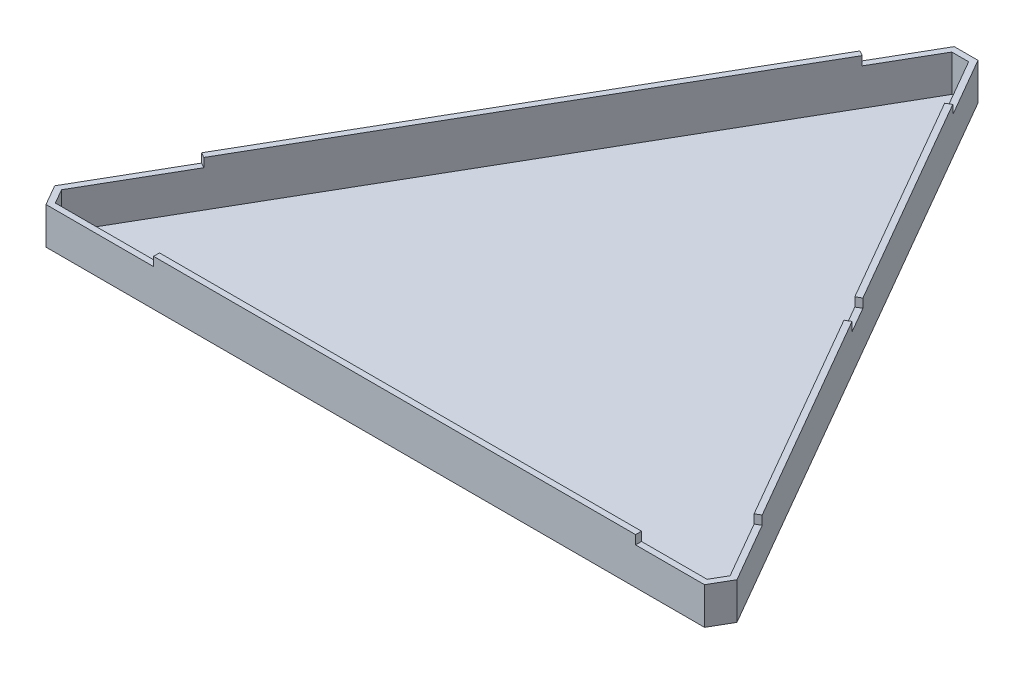
ISO-10303-21;
HEADER;
FILE_DESCRIPTION(('STEP AP214'),'2;1');
FILE_NAME('part.step','',(''),(''),'','','');
FILE_SCHEMA(('AUTOMOTIVE_DESIGN { 1 0 10303 214 1 1 1 1 }'));
ENDSEC;
DATA;
#1=APPLICATION_CONTEXT('core data for automotive mechanical design processes');
#2=APPLICATION_PROTOCOL_DEFINITION('international standard','automotive_design',2000,#1);
#3=PRODUCT_CONTEXT('',#1,'mechanical');
#4=PRODUCT('Part','Part','',(#3));
#5=PRODUCT_RELATED_PRODUCT_CATEGORY('part','',(#4));
#6=PRODUCT_DEFINITION_FORMATION('','',#4);
#7=PRODUCT_DEFINITION_CONTEXT('part definition',#1,'design');
#8=PRODUCT_DEFINITION('design','',#6,#7);
#9=PRODUCT_DEFINITION_SHAPE('','',#8);
#10=(LENGTH_UNIT() NAMED_UNIT(*) SI_UNIT(.MILLI.,.METRE.));
#11=(NAMED_UNIT(*) PLANE_ANGLE_UNIT() SI_UNIT($,.RADIAN.));
#12=(NAMED_UNIT(*) SI_UNIT($,.STERADIAN.) SOLID_ANGLE_UNIT());
#13=UNCERTAINTY_MEASURE_WITH_UNIT(LENGTH_MEASURE(1.E-05),#10,'distance_accuracy_value','');
#14=(GEOMETRIC_REPRESENTATION_CONTEXT(3) GLOBAL_UNCERTAINTY_ASSIGNED_CONTEXT((#13)) GLOBAL_UNIT_ASSIGNED_CONTEXT((#10,
#11,#12)) REPRESENTATION_CONTEXT('',''));
#15=CARTESIAN_POINT('',(0.,0.,0.));
#16=DIRECTION('',(0.,0.,1.));
#17=DIRECTION('',(1.,0.,0.));
#18=AXIS2_PLACEMENT_3D('',#15,#16,#17);
#19=CARTESIAN_POINT('',(0.,0.08,0.));
#20=DIRECTION('',(0.,1.,0.));
#21=DIRECTION('',(0.,0.,1.));
#22=AXIS2_PLACEMENT_3D('',#19,#20,#21);
#23=PLANE('',#22);
#24=DIRECTION('',(0.500000000000268,0.,-0.866025403784284));
#25=VECTOR('',#24,1.);
#26=CARTESIAN_POINT('',(84.5179491924025,0.08,48.7964607176236));
#27=LINE('',#26,#25);
#28=CARTESIAN_POINT('',(109.845299461621,0.08,4.92820323027552));
#29=VERTEX_POINT('',#28);
#30=CARTESIAN_POINT('',(112.690598923244,0.08,0.));
#31=VERTEX_POINT('',#30);
#32=EDGE_CURVE('E420',#29,#31,#27,.T.);
#33=ORIENTED_EDGE('',*,*,#32,.T.);
#34=DIRECTION('',(0.500000000000004,0.,0.866025403784437));
#35=VECTOR('',#34,1.);
#36=CARTESIAN_POINT('',(84.5179491924322,0.08,-48.7964607176063));
#37=LINE('',#36,#35);
#38=CARTESIAN_POINT('',(2.84529946162275,0.08,-190.257639640145));
#39=VERTEX_POINT('',#38);
#40=EDGE_CURVE('E60',#39,#31,#37,.T.);
#41=ORIENTED_EDGE('',*,*,#40,.F.);
#42=DIRECTION('',(1.,0.,-3.02401506656851E-13));
#43=VECTOR('',#42,1.);
#44=CARTESIAN_POINT('',(-5.7534196880156E-11,0.08,-190.257639640144));
#45=LINE('',#44,#43);
#46=CARTESIAN_POINT('',(-2.84529946162175,0.08,-190.257639640144));
#47=VERTEX_POINT('',#46);
#48=EDGE_CURVE('E424',#47,#39,#45,.T.);
#49=ORIENTED_EDGE('',*,*,#48,.F.);
#50=DIRECTION('',(-0.499999999999966,0.,0.866025403784458));
#51=VECTOR('',#50,1.);
#52=CARTESIAN_POINT('',(-84.5179491924274,0.08,-48.7964607175987));
#53=LINE('',#52,#51);
#54=CARTESIAN_POINT('',(-112.690598923241,0.08,0.));
#55=VERTEX_POINT('',#54);
#56=EDGE_CURVE('E52',#47,#55,#53,.T.);
#57=ORIENTED_EDGE('',*,*,#56,.T.);
#58=DIRECTION('',(-0.499999999999998,0.,-0.86602540378444));
#59=VECTOR('',#58,1.);
#60=CARTESIAN_POINT('',(-84.5179491924314,0.08,48.7964607176051));
#61=LINE('',#60,#59);
#62=CARTESIAN_POINT('',(-109.845299461621,0.0800000000000002,4.92820323027554));
#63=VERTEX_POINT('',#62);
#64=EDGE_CURVE('E388',#63,#55,#61,.T.);
#65=ORIENTED_EDGE('',*,*,#64,.F.);
#66=DIRECTION('',(1.,0.,0.));
#67=VECTOR('',#66,1.);
#68=CARTESIAN_POINT('',(0.,0.08,4.92820323027603));
#69=LINE('',#68,#67);
#70=EDGE_CURVE('E418',#63,#29,#69,.T.);
#71=ORIENTED_EDGE('',*,*,#70,.T.);
#72=EDGE_LOOP('',(#33,#41,#49,#57,#65,#71));
#73=FACE_BOUND('',#72,.T.);
#74=ADVANCED_FACE('F37',(#73),#23,.T.);
#75=CARTESIAN_POINT('',(86.25,0.08,-49.7964607176053));
#76=DIRECTION('',(-0.866025403784439,0.,0.5));
#77=DIRECTION('',(0.5,0.,0.866025403784439));
#78=AXIS2_PLACEMENT_3D('',#75,#76,#77);
#79=PLANE('',#78);
#80=DIRECTION('',(-0.5,0.,-0.866025403784439));
#81=VECTOR('',#80,1.);
#82=CARTESIAN_POINT('',(86.25,0.,-49.7964607176053));
#83=LINE('',#82,#81);
#84=CARTESIAN_POINT('',(115.,0.,0.));
#85=VERTEX_POINT('',#84);
#86=CARTESIAN_POINT('',(4.,0.,-192.257639640145));
#87=VERTEX_POINT('',#86);
#88=EDGE_CURVE('E422',#85,#87,#83,.T.);
#89=ORIENTED_EDGE('',*,*,#88,.T.);
#90=DIRECTION('',(0.,-1.,0.));
#91=VECTOR('',#90,1.);
#92=CARTESIAN_POINT('',(4.,12.46,-192.257639640145));
#93=LINE('',#92,#91);
#94=CARTESIAN_POINT('',(4.,12.46,-192.257639640145));
#95=VERTEX_POINT('',#94);
#96=EDGE_CURVE('E357',#95,#87,#93,.T.);
#97=ORIENTED_EDGE('',*,*,#96,.F.);
#98=DIRECTION('',(0.500000000000004,0.,0.866025403784436));
#99=VECTOR('',#98,1.);
#100=CARTESIAN_POINT('',(86.2500000000004,12.46,-49.796460717606));
#101=LINE('',#100,#99);
#102=CARTESIAN_POINT('',(15.625000000015,12.46,-172.122549002131));
#103=VERTEX_POINT('',#102);
#104=EDGE_CURVE('E326',#95,#103,#101,.T.);
#105=ORIENTED_EDGE('',*,*,#104,.T.);
#106=DIRECTION('',(0.,-1.,0.));
#107=VECTOR('',#106,1.);
#108=CARTESIAN_POINT('',(15.625000000015,15.46,-172.122549002131));
#109=LINE('',#108,#107);
#110=CARTESIAN_POINT('',(15.625000000015,15.46,-172.122549002131));
#111=VERTEX_POINT('',#110);
#112=EDGE_CURVE('E268',#111,#103,#109,.T.);
#113=ORIENTED_EDGE('',*,*,#112,.F.);
#114=DIRECTION('',(0.500000000000004,0.,0.866025403784437));
#115=VECTOR('',#114,1.);
#116=CARTESIAN_POINT('',(86.2500000000004,15.46,-49.7964607176059));
#117=LINE('',#116,#115);
#118=CARTESIAN_POINT('',(57.0000000000145,15.46,-100.458946838971));
#119=VERTEX_POINT('',#118);
#120=EDGE_CURVE('E250',#111,#119,#117,.T.);
#121=ORIENTED_EDGE('',*,*,#120,.T.);
#122=DIRECTION('',(0.,-1.,0.));
#123=VECTOR('',#122,1.);
#124=CARTESIAN_POINT('',(57.0000000000145,15.46,-100.458946838971));
#125=LINE('',#124,#123);
#126=CARTESIAN_POINT('',(57.0000000000145,12.46,-100.458946838971));
#127=VERTEX_POINT('',#126);
#128=EDGE_CURVE('E270',#119,#127,#125,.T.);
#129=ORIENTED_EDGE('',*,*,#128,.T.);
#130=DIRECTION('',(0.499999999999934,0.,0.866025403784477));
#131=VECTOR('',#130,1.);
#132=CARTESIAN_POINT('',(86.2500000000003,12.46,-49.7964607175967));
#133=LINE('',#132,#131);
#134=CARTESIAN_POINT('',(62.0000000000138,12.46,-91.7986928011259));
#135=VERTEX_POINT('',#134);
#136=EDGE_CURVE('E317',#127,#135,#133,.T.);
#137=ORIENTED_EDGE('',*,*,#136,.T.);
#138=DIRECTION('',(0.,-1.,0.));
#139=VECTOR('',#138,1.);
#140=CARTESIAN_POINT('',(62.0000000000138,15.46,-91.7986928011259));
#141=LINE('',#140,#139);
#142=CARTESIAN_POINT('',(62.0000000000138,15.46,-91.7986928011259));
#143=VERTEX_POINT('',#142);
#144=EDGE_CURVE('E495',#143,#135,#141,.T.);
#145=ORIENTED_EDGE('',*,*,#144,.F.);
#146=DIRECTION('',(0.500000000000004,0.,0.866025403784436));
#147=VECTOR('',#146,1.);
#148=CARTESIAN_POINT('',(86.2499999999997,15.46,-49.7964607176056));
#149=LINE('',#148,#147);
#150=CARTESIAN_POINT('',(103.375000000009,15.46,-20.1350906379728));
#151=VERTEX_POINT('',#150);
#152=EDGE_CURVE('E240',#143,#151,#149,.T.);
#153=ORIENTED_EDGE('',*,*,#152,.T.);
#154=DIRECTION('',(0.,-1.,0.));
#155=VECTOR('',#154,1.);
#156=CARTESIAN_POINT('',(103.375000000009,15.46,-20.1350906379728));
#157=LINE('',#156,#155);
#158=CARTESIAN_POINT('',(103.375000000009,12.46,-20.1350906379728));
#159=VERTEX_POINT('',#158);
#160=EDGE_CURVE('E252',#151,#159,#157,.T.);
#161=ORIENTED_EDGE('',*,*,#160,.T.);
#162=DIRECTION('',(-0.5,0.,-0.866025403784439));
#163=VECTOR('',#162,1.);
#164=CARTESIAN_POINT('',(86.25,12.46,-49.7964607176053));
#165=LINE('',#164,#163);
#166=CARTESIAN_POINT('',(115.,12.46,0.));
#167=VERTEX_POINT('',#166);
#168=EDGE_CURVE('E410',#167,#159,#165,.T.);
#169=ORIENTED_EDGE('',*,*,#168,.F.);
#170=DIRECTION('',(0.,-1.,0.));
#171=VECTOR('',#170,1.);
#172=CARTESIAN_POINT('',(115.,0.08,0.));
#173=LINE('',#172,#171);
#174=EDGE_CURVE('E429',#167,#85,#173,.T.);
#175=ORIENTED_EDGE('',*,*,#174,.T.);
#176=EDGE_LOOP('',(#89,#97,#105,#113,#121,#129,#137,#145,#153,#161,#169,#175));
#177=FACE_BOUND('',#176,.T.);
#178=ADVANCED_FACE('F39',(#177),#79,.F.);
#179=CARTESIAN_POINT('',(-86.2499999999976,0.08,-49.7964607176066));
#180=DIRECTION('',(-0.866025403784426,0.,-0.500000000000021));
#181=DIRECTION('',(-0.500000000000021,0.,0.866025403784427));
#182=AXIS2_PLACEMENT_3D('',#179,#180,#181);
#183=PLANE('',#182);
#184=DIRECTION('',(0.,-1.,0.));
#185=VECTOR('',#184,1.);
#186=CARTESIAN_POINT('',(-4.,12.46,-192.257639640145));
#187=LINE('',#186,#185);
#188=CARTESIAN_POINT('',(-4.,12.46,-192.257639640145));
#189=VERTEX_POINT('',#188);
#190=CARTESIAN_POINT('',(-4.,0.,-192.257639640145));
#191=VERTEX_POINT('',#190);
#192=EDGE_CURVE('E354',#189,#191,#187,.T.);
#193=ORIENTED_EDGE('',*,*,#192,.T.);
#194=DIRECTION('',(0.500000000000021,0.,-0.866025403784427));
#195=VECTOR('',#194,1.);
#196=CARTESIAN_POINT('',(-86.2499999999976,0.,-49.7964607176066));
#197=LINE('',#196,#195);
#198=CARTESIAN_POINT('',(-115.,0.,0.));
#199=VERTEX_POINT('',#198);
#200=EDGE_CURVE('E431',#199,#191,#197,.T.);
#201=ORIENTED_EDGE('',*,*,#200,.F.);
#202=DIRECTION('',(0.,-1.,0.));
#203=VECTOR('',#202,1.);
#204=CARTESIAN_POINT('',(-115.,0.08,0.));
#205=LINE('',#204,#203);
#206=CARTESIAN_POINT('',(-115.,12.46,0.));
#207=VERTEX_POINT('',#206);
#208=EDGE_CURVE('E11',#207,#199,#205,.T.);
#209=ORIENTED_EDGE('',*,*,#208,.F.);
#210=DIRECTION('',(0.500000000000021,0.,-0.866025403784427));
#211=VECTOR('',#210,1.);
#212=CARTESIAN_POINT('',(-86.2499999999976,12.46,-49.7964607176066));
#213=LINE('',#212,#211);
#214=CARTESIAN_POINT('',(-96.8699999999991,12.46,-31.4020811412236));
#215=VERTEX_POINT('',#214);
#216=EDGE_CURVE('E362',#207,#215,#213,.T.);
#217=ORIENTED_EDGE('',*,*,#216,.T.);
#218=DIRECTION('',(0.,-1.,0.));
#219=VECTOR('',#218,1.);
#220=CARTESIAN_POINT('',(-96.8699999999991,15.46,-31.4020811412236));
#221=LINE('',#220,#219);
#222=CARTESIAN_POINT('',(-96.8699999999991,15.46,-31.4020811412236));
#223=VERTEX_POINT('',#222);
#224=EDGE_CURVE('E292',#223,#215,#221,.T.);
#225=ORIENTED_EDGE('',*,*,#224,.F.);
#226=DIRECTION('',(0.499999999999995,0.,-0.866025403784441));
#227=VECTOR('',#226,1.);
#228=CARTESIAN_POINT('',(-86.2499999999996,15.46,-49.7964607176044));
#229=LINE('',#228,#227);
#230=CARTESIAN_POINT('',(-15.6250000000001,15.46,-172.122549002157));
#231=VERTEX_POINT('',#230);
#232=EDGE_CURVE('E273',#223,#231,#229,.T.);
#233=ORIENTED_EDGE('',*,*,#232,.T.);
#234=DIRECTION('',(0.,-1.,0.));
#235=VECTOR('',#234,1.);
#236=CARTESIAN_POINT('',(-15.6250000000001,15.46,-172.122549002157));
#237=LINE('',#236,#235);
#238=CARTESIAN_POINT('',(-15.6250000000001,12.46,-172.122549002157));
#239=VERTEX_POINT('',#238);
#240=EDGE_CURVE('E284',#231,#239,#237,.T.);
#241=ORIENTED_EDGE('',*,*,#240,.T.);
#242=DIRECTION('',(0.500000000000003,0.,-0.866025403784437));
#243=VECTOR('',#242,1.);
#244=CARTESIAN_POINT('',(-86.2500000000003,12.46,-49.7964607176057));
#245=LINE('',#244,#243);
#246=EDGE_CURVE('E331',#239,#189,#245,.T.);
#247=ORIENTED_EDGE('',*,*,#246,.T.);
#248=EDGE_LOOP('',(#193,#201,#209,#217,#225,#233,#241,#247));
#249=FACE_BOUND('',#248,.T.);
#250=ADVANCED_FACE('F482',(#249),#183,.T.);
#251=CARTESIAN_POINT('',(-86.25,0.08,49.7964607176052));
#252=DIRECTION('',(0.866025403784439,0.,-0.5));
#253=DIRECTION('',(-0.5,0.,-0.866025403784439));
#254=AXIS2_PLACEMENT_3D('',#251,#252,#253);
#255=PLANE('',#254);
#256=DIRECTION('',(0.5,0.,0.866025403784439));
#257=VECTOR('',#256,1.);
#258=CARTESIAN_POINT('',(-86.25,0.,49.7964607176052));
#259=LINE('',#258,#257);
#260=CARTESIAN_POINT('',(-111.,0.,6.92820323027554));
#261=VERTEX_POINT('',#260);
#262=EDGE_CURVE('E433',#199,#261,#259,.T.);
#263=ORIENTED_EDGE('',*,*,#262,.T.);
#264=DIRECTION('',(0.,-1.,0.));
#265=VECTOR('',#264,1.);
#266=CARTESIAN_POINT('',(-111.,0.08,6.92820323027554));
#267=LINE('',#266,#265);
#268=CARTESIAN_POINT('',(-111.,12.46,6.92820323027554));
#269=VERTEX_POINT('',#268);
#270=EDGE_CURVE('E45',#269,#261,#267,.T.);
#271=ORIENTED_EDGE('',*,*,#270,.F.);
#272=DIRECTION('',(0.5,0.,0.866025403784439));
#273=VECTOR('',#272,1.);
#274=CARTESIAN_POINT('',(-86.25,12.46,49.7964607176052));
#275=LINE('',#274,#273);
#276=EDGE_CURVE('E365',#207,#269,#275,.T.);
#277=ORIENTED_EDGE('',*,*,#276,.F.);
#278=ORIENTED_EDGE('',*,*,#208,.T.);
#279=EDGE_LOOP('',(#263,#271,#277,#278));
#280=FACE_BOUND('',#279,.T.);
#281=ADVANCED_FACE('F480',(#280),#255,.F.);
#282=CARTESIAN_POINT('',(0.,0.08,6.92820323027546));
#283=DIRECTION('',(0.,0.,-1.));
#284=DIRECTION('',(-1.,0.,0.));
#285=AXIS2_PLACEMENT_3D('',#282,#283,#284);
#286=PLANE('',#285);
#287=DIRECTION('',(1.,0.,0.));
#288=VECTOR('',#287,1.);
#289=CARTESIAN_POINT('',(0.,12.46,6.92820323027546));
#290=LINE('',#289,#288);
#291=CARTESIAN_POINT('',(87.75,12.46,6.92820323027546));
#292=VERTEX_POINT('',#291);
#293=CARTESIAN_POINT('',(111.,12.46,6.92820323027546));
#294=VERTEX_POINT('',#293);
#295=EDGE_CURVE('E404',#292,#294,#290,.T.);
#296=ORIENTED_EDGE('',*,*,#295,.F.);
#297=DIRECTION('',(0.,-1.,0.));
#298=VECTOR('',#297,1.);
#299=CARTESIAN_POINT('',(87.75,15.46,6.92820323027546));
#300=LINE('',#299,#298);
#301=CARTESIAN_POINT('',(87.75,15.46,6.92820323027546));
#302=VERTEX_POINT('',#301);
#303=EDGE_CURVE('E311',#302,#292,#300,.T.);
#304=ORIENTED_EDGE('',*,*,#303,.F.);
#305=DIRECTION('',(-1.,0.,0.));
#306=VECTOR('',#305,1.);
#307=CARTESIAN_POINT('',(0.,15.46,6.92820323027639));
#308=LINE('',#307,#306);
#309=CARTESIAN_POINT('',(-74.739999999997,15.46,6.92820323027718));
#310=VERTEX_POINT('',#309);
#311=EDGE_CURVE('E297',#302,#310,#308,.T.);
#312=ORIENTED_EDGE('',*,*,#311,.T.);
#313=DIRECTION('',(0.,-1.,0.));
#314=VECTOR('',#313,1.);
#315=CARTESIAN_POINT('',(-74.739999999997,15.46,6.92820323027718));
#316=LINE('',#315,#314);
#317=CARTESIAN_POINT('',(-74.739999999997,12.46,6.92820323027718));
#318=VERTEX_POINT('',#317);
#319=EDGE_CURVE('E313',#310,#318,#316,.T.);
#320=ORIENTED_EDGE('',*,*,#319,.T.);
#321=DIRECTION('',(1.,0.,0.));
#322=VECTOR('',#321,1.);
#323=CARTESIAN_POINT('',(-3.1521261630446E-13,12.46,6.92820323028058));
#324=LINE('',#323,#322);
#325=EDGE_CURVE('E368',#269,#318,#324,.T.);
#326=ORIENTED_EDGE('',*,*,#325,.F.);
#327=ORIENTED_EDGE('',*,*,#270,.T.);
#328=DIRECTION('',(1.,0.,0.));
#329=VECTOR('',#328,1.);
#330=CARTESIAN_POINT('',(0.,0.,6.92820323027546));
#331=LINE('',#330,#329);
#332=CARTESIAN_POINT('',(111.,0.,6.92820323027546));
#333=VERTEX_POINT('',#332);
#334=EDGE_CURVE('E435',#261,#333,#331,.T.);
#335=ORIENTED_EDGE('',*,*,#334,.T.);
#336=DIRECTION('',(0.,-1.,0.));
#337=VECTOR('',#336,1.);
#338=CARTESIAN_POINT('',(111.,0.08,6.92820323027546));
#339=LINE('',#338,#337);
#340=EDGE_CURVE('E440',#294,#333,#339,.T.);
#341=ORIENTED_EDGE('',*,*,#340,.F.);
#342=EDGE_LOOP('',(#296,#304,#312,#320,#326,#327,#335,#341));
#343=FACE_BOUND('',#342,.T.);
#344=ADVANCED_FACE('F447',(#343),#286,.F.);
#345=CARTESIAN_POINT('',(86.25,0.08,49.7964607176052));
#346=DIRECTION('',(0.866025403784439,0.,0.5));
#347=DIRECTION('',(0.5,0.,-0.866025403784439));
#348=AXIS2_PLACEMENT_3D('',#345,#346,#347);
#349=PLANE('',#348);
#350=DIRECTION('',(-0.5,0.,0.866025403784439));
#351=VECTOR('',#350,1.);
#352=CARTESIAN_POINT('',(86.25,0.,49.7964607176052));
#353=LINE('',#352,#351);
#354=EDGE_CURVE('E425',#85,#333,#353,.T.);
#355=ORIENTED_EDGE('',*,*,#354,.F.);
#356=ORIENTED_EDGE('',*,*,#174,.F.);
#357=DIRECTION('',(-0.5,0.,0.866025403784439));
#358=VECTOR('',#357,1.);
#359=CARTESIAN_POINT('',(86.25,12.46,49.7964607176052));
#360=LINE('',#359,#358);
#361=EDGE_CURVE('E407',#167,#294,#360,.T.);
#362=ORIENTED_EDGE('',*,*,#361,.T.);
#363=ORIENTED_EDGE('',*,*,#340,.T.);
#364=EDGE_LOOP('',(#355,#356,#362,#363));
#365=FACE_BOUND('',#364,.T.);
#366=ADVANCED_FACE('F458',(#365),#349,.T.);
#367=CARTESIAN_POINT('',(0.,0.,0.));
#368=DIRECTION('',(0.,1.,0.));
#369=DIRECTION('',(0.,0.,1.));
#370=AXIS2_PLACEMENT_3D('',#367,#368,#369);
#371=PLANE('',#370);
#372=DIRECTION('',(-1.,0.,0.));
#373=VECTOR('',#372,1.);
#374=CARTESIAN_POINT('',(0.,0.,-192.257639640145));
#375=LINE('',#374,#373);
#376=EDGE_CURVE('E325',#87,#191,#375,.T.);
#377=ORIENTED_EDGE('',*,*,#376,.F.);
#378=ORIENTED_EDGE('',*,*,#88,.F.);
#379=ORIENTED_EDGE('',*,*,#354,.T.);
#380=ORIENTED_EDGE('',*,*,#334,.F.);
#381=ORIENTED_EDGE('',*,*,#262,.F.);
#382=ORIENTED_EDGE('',*,*,#200,.T.);
#383=EDGE_LOOP('',(#377,#378,#379,#380,#381,#382));
#384=FACE_BOUND('',#383,.T.);
#385=ADVANCED_FACE('F453',(#384),#371,.F.);
#386=CARTESIAN_POINT('',(84.5179491924322,12.46,-48.7964607176064));
#387=DIRECTION('',(0.866025403784436,0.,-0.500000000000004));
#388=DIRECTION('',(-0.500000000000004,0.,-0.866025403784436));
#389=AXIS2_PLACEMENT_3D('',#386,#387,#388);
#390=PLANE('',#389);
#391=ORIENTED_EDGE('',*,*,#40,.T.);
#392=DIRECTION('',(0.,-1.,0.));
#393=VECTOR('',#392,1.);
#394=CARTESIAN_POINT('',(112.690598923244,12.46,0.));
#395=LINE('',#394,#393);
#396=CARTESIAN_POINT('',(112.690598923244,12.46,0.));
#397=VERTEX_POINT('',#396);
#398=EDGE_CURVE('E415',#397,#31,#395,.T.);
#399=ORIENTED_EDGE('',*,*,#398,.F.);
#400=DIRECTION('',(0.500000000000004,0.,0.866025403784436));
#401=VECTOR('',#400,1.);
#402=CARTESIAN_POINT('',(84.5179491924322,12.46,-48.7964607176064));
#403=LINE('',#402,#401);
#404=CARTESIAN_POINT('',(101.642949192441,12.46,-19.1350906379736));
#405=VERTEX_POINT('',#404);
#406=EDGE_CURVE('E394',#405,#397,#403,.T.);
#407=ORIENTED_EDGE('',*,*,#406,.F.);
#408=DIRECTION('',(0.,-1.,0.));
#409=VECTOR('',#408,1.);
#410=CARTESIAN_POINT('',(101.642949192441,15.46,-19.1350906379736));
#411=LINE('',#410,#409);
#412=CARTESIAN_POINT('',(101.642949192441,15.46,-19.1350906379736));
#413=VERTEX_POINT('',#412);
#414=EDGE_CURVE('E229',#413,#405,#411,.T.);
#415=ORIENTED_EDGE('',*,*,#414,.F.);
#416=DIRECTION('',(0.500000000000004,0.,0.866025403784437));
#417=VECTOR('',#416,1.);
#418=CARTESIAN_POINT('',(84.5179491924322,15.46,-48.7964607176063));
#419=LINE('',#418,#417);
#420=CARTESIAN_POINT('',(60.2679491924464,15.46,-90.7986928011267));
#421=VERTEX_POINT('',#420);
#422=EDGE_CURVE('E222',#421,#413,#419,.T.);
#423=ORIENTED_EDGE('',*,*,#422,.F.);
#424=DIRECTION('',(0.,-1.,0.));
#425=VECTOR('',#424,1.);
#426=CARTESIAN_POINT('',(60.2679491924464,15.46,-90.7986928011267));
#427=LINE('',#426,#425);
#428=CARTESIAN_POINT('',(60.2679491924464,12.46,-90.7986928011267));
#429=VERTEX_POINT('',#428);
#430=EDGE_CURVE('E227',#421,#429,#427,.T.);
#431=ORIENTED_EDGE('',*,*,#430,.T.);
#432=DIRECTION('',(0.500000000000004,0.,0.866025403784437));
#433=VECTOR('',#432,1.);
#434=CARTESIAN_POINT('',(84.5179491924323,12.46,-48.7964607176064));
#435=LINE('',#434,#433);
#436=CARTESIAN_POINT('',(55.2679491924463,12.46,-99.4589468389711));
#437=VERTEX_POINT('',#436);
#438=EDGE_CURVE('E323',#437,#429,#435,.T.);
#439=ORIENTED_EDGE('',*,*,#438,.F.);
#440=DIRECTION('',(0.,-1.,0.));
#441=VECTOR('',#440,1.);
#442=CARTESIAN_POINT('',(55.2679491924463,15.46,-99.4589468389711));
#443=LINE('',#442,#441);
#444=CARTESIAN_POINT('',(55.2679491924463,15.46,-99.4589468389711));
#445=VERTEX_POINT('',#444);
#446=EDGE_CURVE('E263',#445,#437,#443,.T.);
#447=ORIENTED_EDGE('',*,*,#446,.F.);
#448=DIRECTION('',(-0.500000000000004,0.,-0.866025403784437));
#449=VECTOR('',#448,1.);
#450=CARTESIAN_POINT('',(84.5179491924322,15.46,-48.7964607176063));
#451=LINE('',#450,#449);
#452=CARTESIAN_POINT('',(13.8929491924469,15.46,-171.122549002132));
#453=VERTEX_POINT('',#452);
#454=EDGE_CURVE('E260',#445,#453,#451,.T.);
#455=ORIENTED_EDGE('',*,*,#454,.T.);
#456=DIRECTION('',(0.,-1.,0.));
#457=VECTOR('',#456,1.);
#458=CARTESIAN_POINT('',(13.8929491924469,15.46,-171.122549002132));
#459=LINE('',#458,#457);
#460=CARTESIAN_POINT('',(13.8929491924469,12.46,-171.122549002132));
#461=VERTEX_POINT('',#460);
#462=EDGE_CURVE('E265',#453,#461,#459,.T.);
#463=ORIENTED_EDGE('',*,*,#462,.T.);
#464=DIRECTION('',(0.49999999999997,0.,0.866025403784456));
#465=VECTOR('',#464,1.);
#466=CARTESIAN_POINT('',(84.5179491924294,12.46,-48.7964607176003));
#467=LINE('',#466,#465);
#468=CARTESIAN_POINT('',(2.84529946162275,12.46,-190.257639640145));
#469=VERTEX_POINT('',#468);
#470=EDGE_CURVE('E342',#469,#461,#467,.T.);
#471=ORIENTED_EDGE('',*,*,#470,.F.);
#472=DIRECTION('',(0.,-1.,0.));
#473=VECTOR('',#472,1.);
#474=CARTESIAN_POINT('',(2.84529946162275,12.46,-190.257639640145));
#475=LINE('',#474,#473);
#476=EDGE_CURVE('E347',#469,#39,#475,.T.);
#477=ORIENTED_EDGE('',*,*,#476,.T.);
#478=EDGE_LOOP('',(#391,#399,#407,#415,#423,#431,#439,#447,#455,#463,#471,#477));
#479=FACE_BOUND('',#478,.T.);
#480=ADVANCED_FACE('F224',(#479),#390,.F.);
#481=CARTESIAN_POINT('',(84.5179491924025,12.46,48.7964607176236));
#482=DIRECTION('',(0.866025403784284,0.,0.500000000000268));
#483=DIRECTION('',(0.500000000000268,0.,-0.866025403784284));
#484=AXIS2_PLACEMENT_3D('',#481,#482,#483);
#485=PLANE('',#484);
#486=ORIENTED_EDGE('',*,*,#32,.F.);
#487=DIRECTION('',(0.,-1.,0.));
#488=VECTOR('',#487,1.);
#489=CARTESIAN_POINT('',(109.845299461621,12.46,4.92820323027552));
#490=LINE('',#489,#488);
#491=CARTESIAN_POINT('',(109.845299461621,12.46,4.92820323027552));
#492=VERTEX_POINT('',#491);
#493=EDGE_CURVE('E412',#492,#29,#490,.T.);
#494=ORIENTED_EDGE('',*,*,#493,.F.);
#495=DIRECTION('',(-0.500000000000268,0.,0.866025403784284));
#496=VECTOR('',#495,1.);
#497=CARTESIAN_POINT('',(84.5179491924025,12.46,48.7964607176236));
#498=LINE('',#497,#496);
#499=EDGE_CURVE('E396',#397,#492,#498,.T.);
#500=ORIENTED_EDGE('',*,*,#499,.F.);
#501=ORIENTED_EDGE('',*,*,#398,.T.);
#502=EDGE_LOOP('',(#486,#494,#500,#501));
#503=FACE_BOUND('',#502,.T.);
#504=ADVANCED_FACE('F529',(#503),#485,.F.);
#505=CARTESIAN_POINT('',(0.,12.46,4.92820323027603));
#506=DIRECTION('',(0.,0.,1.));
#507=DIRECTION('',(1.,0.,0.));
#508=AXIS2_PLACEMENT_3D('',#505,#506,#507);
#509=PLANE('',#508);
#510=ORIENTED_EDGE('',*,*,#70,.F.);
#511=DIRECTION('',(0.,-1.,0.));
#512=VECTOR('',#511,1.);
#513=CARTESIAN_POINT('',(-109.845299461621,12.46,4.92820323027554));
#514=LINE('',#513,#512);
#515=CARTESIAN_POINT('',(-109.845299461621,12.46,4.92820323027554));
#516=VERTEX_POINT('',#515);
#517=EDGE_CURVE('E385',#516,#63,#514,.T.);
#518=ORIENTED_EDGE('',*,*,#517,.F.);
#519=DIRECTION('',(1.,0.,0.));
#520=VECTOR('',#519,1.);
#521=CARTESIAN_POINT('',(-1.24807318528596E-13,12.46,4.92820323027832));
#522=LINE('',#521,#520);
#523=CARTESIAN_POINT('',(-74.739999999997,12.46,4.92820323027643));
#524=VERTEX_POINT('',#523);
#525=EDGE_CURVE('E374',#516,#524,#522,.T.);
#526=ORIENTED_EDGE('',*,*,#525,.T.);
#527=DIRECTION('',(0.,-1.,0.));
#528=VECTOR('',#527,1.);
#529=CARTESIAN_POINT('',(-74.739999999997,15.46,4.92820323027643));
#530=LINE('',#529,#528);
#531=CARTESIAN_POINT('',(-74.739999999997,15.46,4.92820323027643));
#532=VERTEX_POINT('',#531);
#533=EDGE_CURVE('E306',#532,#524,#530,.T.);
#534=ORIENTED_EDGE('',*,*,#533,.F.);
#535=DIRECTION('',(1.,0.,0.));
#536=VECTOR('',#535,1.);
#537=CARTESIAN_POINT('',(0.,15.46,4.92820323027606));
#538=LINE('',#537,#536);
#539=CARTESIAN_POINT('',(87.75,15.46,4.92820323027563));
#540=VERTEX_POINT('',#539);
#541=EDGE_CURVE('E303',#532,#540,#538,.T.);
#542=ORIENTED_EDGE('',*,*,#541,.T.);
#543=DIRECTION('',(0.,-1.,0.));
#544=VECTOR('',#543,1.);
#545=CARTESIAN_POINT('',(87.75,15.46,4.92820323027563));
#546=LINE('',#545,#544);
#547=CARTESIAN_POINT('',(87.75,12.46,4.92820323027563));
#548=VERTEX_POINT('',#547);
#549=EDGE_CURVE('E308',#540,#548,#546,.T.);
#550=ORIENTED_EDGE('',*,*,#549,.T.);
#551=DIRECTION('',(-1.,0.,0.));
#552=VECTOR('',#551,1.);
#553=CARTESIAN_POINT('',(0.,12.46,4.92820323027603));
#554=LINE('',#553,#552);
#555=EDGE_CURVE('E398',#492,#548,#554,.T.);
#556=ORIENTED_EDGE('',*,*,#555,.F.);
#557=ORIENTED_EDGE('',*,*,#493,.T.);
#558=EDGE_LOOP('',(#510,#518,#526,#534,#542,#550,#556,#557));
#559=FACE_BOUND('',#558,.T.);
#560=ADVANCED_FACE('F468',(#559),#509,.F.);
#561=CARTESIAN_POINT('',(0.,12.46,0.));
#562=DIRECTION('',(0.,1.,0.));
#563=DIRECTION('',(0.,0.,1.));
#564=AXIS2_PLACEMENT_3D('',#561,#562,#563);
#565=PLANE('',#564);
#566=DIRECTION('',(-0.866025403784437,0.,0.500000000000003));
#567=VECTOR('',#566,1.);
#568=CARTESIAN_POINT('',(17.1250000000092,12.46,29.6613700796327));
#569=LINE('',#568,#567);
#570=EDGE_CURVE('E391',#159,#405,#569,.T.);
#571=ORIENTED_EDGE('',*,*,#570,.T.);
#572=ORIENTED_EDGE('',*,*,#406,.T.);
#573=ORIENTED_EDGE('',*,*,#499,.T.);
#574=ORIENTED_EDGE('',*,*,#555,.T.);
#575=DIRECTION('',(0.,0.,1.));
#576=VECTOR('',#575,1.);
#577=CARTESIAN_POINT('',(87.75,12.46,0.));
#578=LINE('',#577,#576);
#579=EDGE_CURVE('E401',#548,#292,#578,.T.);
#580=ORIENTED_EDGE('',*,*,#579,.T.);
#581=ORIENTED_EDGE('',*,*,#295,.T.);
#582=ORIENTED_EDGE('',*,*,#361,.F.);
#583=ORIENTED_EDGE('',*,*,#168,.T.);
#584=EDGE_LOOP('',(#571,#572,#573,#574,#580,#581,#582,#583));
#585=FACE_BOUND('',#584,.T.);
#586=ADVANCED_FACE('F462',(#585),#565,.T.);
#587=CARTESIAN_POINT('',(-84.5179491924314,12.46,48.7964607176051));
#588=DIRECTION('',(0.86602540378444,0.,-0.499999999999998));
#589=DIRECTION('',(-0.499999999999998,0.,-0.86602540378444));
#590=AXIS2_PLACEMENT_3D('',#587,#588,#589);
#591=PLANE('',#590);
#592=ORIENTED_EDGE('',*,*,#517,.T.);
#593=ORIENTED_EDGE('',*,*,#64,.T.);
#594=DIRECTION('',(0.,-1.,0.));
#595=VECTOR('',#594,1.);
#596=CARTESIAN_POINT('',(-112.690598923241,12.46,0.));
#597=LINE('',#596,#595);
#598=CARTESIAN_POINT('',(-112.690598923241,12.46,0.));
#599=VERTEX_POINT('',#598);
#600=EDGE_CURVE('E383',#599,#55,#597,.T.);
#601=ORIENTED_EDGE('',*,*,#600,.F.);
#602=DIRECTION('',(0.499999999999998,0.,0.86602540378444));
#603=VECTOR('',#602,1.);
#604=CARTESIAN_POINT('',(-84.5179491924314,12.46,48.7964607176051));
#605=LINE('',#604,#603);
#606=EDGE_CURVE('E377',#599,#516,#605,.T.);
#607=ORIENTED_EDGE('',*,*,#606,.T.);
#608=EDGE_LOOP('',(#592,#593,#601,#607));
#609=FACE_BOUND('',#608,.T.);
#610=ADVANCED_FACE('F525',(#609),#591,.T.);
#611=CARTESIAN_POINT('',(-84.5179491924306,12.46,-48.7964607176055));
#612=DIRECTION('',(-0.866025403784436,0.,-0.500000000000004));
#613=DIRECTION('',(-0.500000000000004,0.,0.866025403784436));
#614=AXIS2_PLACEMENT_3D('',#611,#612,#613);
#615=PLANE('',#614);
#616=ORIENTED_EDGE('',*,*,#600,.T.);
#617=ORIENTED_EDGE('',*,*,#56,.F.);
#618=DIRECTION('',(0.,-1.,0.));
#619=VECTOR('',#618,1.);
#620=CARTESIAN_POINT('',(-2.84529946162175,12.46,-190.257639640144));
#621=LINE('',#620,#619);
#622=CARTESIAN_POINT('',(-2.84529946162175,12.46,-190.257639640144));
#623=VERTEX_POINT('',#622);
#624=EDGE_CURVE('E351',#623,#47,#621,.T.);
#625=ORIENTED_EDGE('',*,*,#624,.F.);
#626=DIRECTION('',(-0.499999999999966,0.,0.866025403784458));
#627=VECTOR('',#626,1.);
#628=CARTESIAN_POINT('',(-84.5179491924274,12.46,-48.7964607175987));
#629=LINE('',#628,#627);
#630=CARTESIAN_POINT('',(-13.8929491924304,12.46,-171.122549002157));
#631=VERTEX_POINT('',#630);
#632=EDGE_CURVE('E337',#623,#631,#629,.T.);
#633=ORIENTED_EDGE('',*,*,#632,.T.);
#634=DIRECTION('',(0.,-1.,0.));
#635=VECTOR('',#634,1.);
#636=CARTESIAN_POINT('',(-13.8929491924304,15.46,-171.122549002157));
#637=LINE('',#636,#635);
#638=CARTESIAN_POINT('',(-13.8929491924304,15.46,-171.122549002157));
#639=VERTEX_POINT('',#638);
#640=EDGE_CURVE('E287',#639,#631,#637,.T.);
#641=ORIENTED_EDGE('',*,*,#640,.F.);
#642=DIRECTION('',(-0.500000000000004,0.,0.866025403784436));
#643=VECTOR('',#642,1.);
#644=CARTESIAN_POINT('',(-84.5179491924307,15.46,-48.7964607176055));
#645=LINE('',#644,#643);
#646=CARTESIAN_POINT('',(-95.1379491924308,15.46,-30.4020811412239));
#647=VERTEX_POINT('',#646);
#648=EDGE_CURVE('E278',#639,#647,#645,.T.);
#649=ORIENTED_EDGE('',*,*,#648,.T.);
#650=DIRECTION('',(0.,-1.,0.));
#651=VECTOR('',#650,1.);
#652=CARTESIAN_POINT('',(-95.1379491924308,15.46,-30.4020811412239));
#653=LINE('',#652,#651);
#654=CARTESIAN_POINT('',(-95.1379491924308,12.46,-30.4020811412239));
#655=VERTEX_POINT('',#654);
#656=EDGE_CURVE('E289',#647,#655,#653,.T.);
#657=ORIENTED_EDGE('',*,*,#656,.T.);
#658=DIRECTION('',(0.500000000000004,0.,-0.866025403784436));
#659=VECTOR('',#658,1.);
#660=CARTESIAN_POINT('',(-84.5179491924306,12.46,-48.7964607176055));
#661=LINE('',#660,#659);
#662=EDGE_CURVE('E380',#599,#655,#661,.T.);
#663=ORIENTED_EDGE('',*,*,#662,.F.);
#664=EDGE_LOOP('',(#616,#617,#625,#633,#641,#649,#657,#663));
#665=FACE_BOUND('',#664,.T.);
#666=ADVANCED_FACE('F521',(#665),#615,.F.);
#667=CARTESIAN_POINT('',(0.,12.46,0.));
#668=DIRECTION('',(0.,1.,0.));
#669=DIRECTION('',(0.,0.,1.));
#670=AXIS2_PLACEMENT_3D('',#667,#668,#669);
#671=PLANE('',#670);
#672=DIRECTION('',(0.866025403784426,0.,0.500000000000022));
#673=VECTOR('',#672,1.);
#674=CARTESIAN_POINT('',(-10.6200000000016,12.46,18.3943795763831));
#675=LINE('',#674,#673);
#676=EDGE_CURVE('E360',#215,#655,#675,.T.);
#677=ORIENTED_EDGE('',*,*,#676,.F.);
#678=ORIENTED_EDGE('',*,*,#216,.F.);
#679=ORIENTED_EDGE('',*,*,#276,.T.);
#680=ORIENTED_EDGE('',*,*,#325,.T.);
#681=DIRECTION('',(0.,0.,-1.));
#682=VECTOR('',#681,1.);
#683=CARTESIAN_POINT('',(-74.739999999997,12.46,0.));
#684=LINE('',#683,#682);
#685=EDGE_CURVE('E371',#318,#524,#684,.T.);
#686=ORIENTED_EDGE('',*,*,#685,.T.);
#687=ORIENTED_EDGE('',*,*,#525,.F.);
#688=ORIENTED_EDGE('',*,*,#606,.F.);
#689=ORIENTED_EDGE('',*,*,#662,.T.);
#690=EDGE_LOOP('',(#677,#678,#679,#680,#686,#687,#688,#689));
#691=FACE_BOUND('',#690,.T.);
#692=ADVANCED_FACE('F477',(#691),#671,.T.);
#693=CARTESIAN_POINT('',(0.,12.46,-192.257639640145));
#694=DIRECTION('',(0.,0.,1.));
#695=DIRECTION('',(1.,0.,0.));
#696=AXIS2_PLACEMENT_3D('',#693,#694,#695);
#697=PLANE('',#696);
#698=ORIENTED_EDGE('',*,*,#376,.T.);
#699=ORIENTED_EDGE('',*,*,#192,.F.);
#700=DIRECTION('',(-1.,0.,0.));
#701=VECTOR('',#700,1.);
#702=CARTESIAN_POINT('',(0.,12.46,-192.257639640145));
#703=LINE('',#702,#701);
#704=EDGE_CURVE('E329',#95,#189,#703,.T.);
#705=ORIENTED_EDGE('',*,*,#704,.F.);
#706=ORIENTED_EDGE('',*,*,#96,.T.);
#707=EDGE_LOOP('',(#698,#699,#705,#706));
#708=FACE_BOUND('',#707,.T.);
#709=ADVANCED_FACE('F485',(#708),#697,.F.);
#710=CARTESIAN_POINT('',(-5.7534196880156E-11,12.46,-190.257639640144));
#711=DIRECTION('',(-3.02401506656851E-13,0.,-1.));
#712=DIRECTION('',(-1.,0.,3.02401506656851E-13));
#713=AXIS2_PLACEMENT_3D('',#710,#711,#712);
#714=PLANE('',#713);
#715=ORIENTED_EDGE('',*,*,#48,.T.);
#716=ORIENTED_EDGE('',*,*,#476,.F.);
#717=DIRECTION('',(1.,0.,-3.02401506656851E-13));
#718=VECTOR('',#717,1.);
#719=CARTESIAN_POINT('',(-5.7534196880156E-11,12.46,-190.257639640144));
#720=LINE('',#719,#718);
#721=EDGE_CURVE('E340',#623,#469,#720,.T.);
#722=ORIENTED_EDGE('',*,*,#721,.F.);
#723=ORIENTED_EDGE('',*,*,#624,.T.);
#724=EDGE_LOOP('',(#715,#716,#722,#723));
#725=FACE_BOUND('',#724,.T.);
#726=ADVANCED_FACE('F519',(#725),#714,.F.);
#727=CARTESIAN_POINT('',(0.,12.46,0.));
#728=DIRECTION('',(0.,1.,0.));
#729=DIRECTION('',(0.,0.,1.));
#730=AXIS2_PLACEMENT_3D('',#727,#728,#729);
#731=PLANE('',#730);
#732=ORIENTED_EDGE('',*,*,#104,.F.);
#733=ORIENTED_EDGE('',*,*,#704,.T.);
#734=ORIENTED_EDGE('',*,*,#246,.F.);
#735=DIRECTION('',(0.866025403784422,0.,0.50000000000003));
#736=VECTOR('',#735,1.);
#737=CARTESIAN_POINT('',(70.6250000000024,12.46,-122.326088284547));
#738=LINE('',#737,#736);
#739=EDGE_CURVE('E334',#239,#631,#738,.T.);
#740=ORIENTED_EDGE('',*,*,#739,.T.);
#741=ORIENTED_EDGE('',*,*,#632,.F.);
#742=ORIENTED_EDGE('',*,*,#721,.T.);
#743=ORIENTED_EDGE('',*,*,#470,.T.);
#744=DIRECTION('',(-0.866025403784434,0.,0.500000000000008));
#745=VECTOR('',#744,1.);
#746=CARTESIAN_POINT('',(-70.6249999999857,12.46,-122.326088284525));
#747=LINE('',#746,#745);
#748=EDGE_CURVE('E345',#103,#461,#747,.T.);
#749=ORIENTED_EDGE('',*,*,#748,.F.);
#750=EDGE_LOOP('',(#732,#733,#734,#740,#741,#742,#743,#749));
#751=FACE_BOUND('',#750,.T.);
#752=ADVANCED_FACE('F514',(#751),#731,.T.);
#753=CARTESIAN_POINT('',(0.,12.46,0.));
#754=DIRECTION('',(0.,1.,0.));
#755=DIRECTION('',(0.,0.,1.));
#756=AXIS2_PLACEMENT_3D('',#753,#754,#755);
#757=PLANE('',#756);
#758=DIRECTION('',(-0.866025403784438,0.,0.500000000000002));
#759=VECTOR('',#758,1.);
#760=CARTESIAN_POINT('',(-24.2499999999859,12.46,-42.0022320835206));
#761=LINE('',#760,#759);
#762=EDGE_CURVE('E246',#135,#429,#761,.T.);
#763=ORIENTED_EDGE('',*,*,#762,.F.);
#764=ORIENTED_EDGE('',*,*,#136,.F.);
#765=DIRECTION('',(-0.866025403784437,0.,0.500000000000002));
#766=VECTOR('',#765,1.);
#767=CARTESIAN_POINT('',(-29.2499999999859,12.46,-50.6624861213649));
#768=LINE('',#767,#766);
#769=EDGE_CURVE('E320',#127,#437,#768,.T.);
#770=ORIENTED_EDGE('',*,*,#769,.T.);
#771=ORIENTED_EDGE('',*,*,#438,.T.);
#772=EDGE_LOOP('',(#763,#764,#770,#771));
#773=FACE_BOUND('',#772,.T.);
#774=ADVANCED_FACE('F500',(#773),#757,.T.);
#775=CARTESIAN_POINT('',(-74.739999999997,15.46,0.));
#776=DIRECTION('',(-1.,0.,0.));
#777=DIRECTION('',(0.,0.,1.));
#778=AXIS2_PLACEMENT_3D('',#775,#776,#777);
#779=PLANE('',#778);
#780=ORIENTED_EDGE('',*,*,#533,.T.);
#781=ORIENTED_EDGE('',*,*,#685,.F.);
#782=ORIENTED_EDGE('',*,*,#319,.F.);
#783=DIRECTION('',(0.,0.,-1.));
#784=VECTOR('',#783,1.);
#785=CARTESIAN_POINT('',(-74.739999999997,15.46,0.));
#786=LINE('',#785,#784);
#787=EDGE_CURVE('E294',#310,#532,#786,.T.);
#788=ORIENTED_EDGE('',*,*,#787,.T.);
#789=EDGE_LOOP('',(#780,#781,#782,#788));
#790=FACE_BOUND('',#789,.T.);
#791=ADVANCED_FACE('F636',(#790),#779,.T.);
#792=CARTESIAN_POINT('',(87.75,15.46,0.));
#793=DIRECTION('',(1.,0.,0.));
#794=DIRECTION('',(0.,0.,-1.));
#795=AXIS2_PLACEMENT_3D('',#792,#793,#794);
#796=PLANE('',#795);
#797=ORIENTED_EDGE('',*,*,#303,.T.);
#798=ORIENTED_EDGE('',*,*,#579,.F.);
#799=ORIENTED_EDGE('',*,*,#549,.F.);
#800=DIRECTION('',(0.,0.,1.));
#801=VECTOR('',#800,1.);
#802=CARTESIAN_POINT('',(87.75,15.46,0.));
#803=LINE('',#802,#801);
#804=EDGE_CURVE('E300',#540,#302,#803,.T.);
#805=ORIENTED_EDGE('',*,*,#804,.T.);
#806=EDGE_LOOP('',(#797,#798,#799,#805));
#807=FACE_BOUND('',#806,.T.);
#808=ADVANCED_FACE('F465',(#807),#796,.T.);
#809=CARTESIAN_POINT('',(0.,15.46,0.));
#810=DIRECTION('',(0.,1.,0.));
#811=DIRECTION('',(0.,0.,1.));
#812=AXIS2_PLACEMENT_3D('',#809,#810,#811);
#813=PLANE('',#812);
#814=ORIENTED_EDGE('',*,*,#787,.F.);
#815=ORIENTED_EDGE('',*,*,#311,.F.);
#816=ORIENTED_EDGE('',*,*,#804,.F.);
#817=ORIENTED_EDGE('',*,*,#541,.F.);
#818=EDGE_LOOP('',(#814,#815,#816,#817));
#819=FACE_BOUND('',#818,.T.);
#820=ADVANCED_FACE('F472',(#819),#813,.T.);
#821=CARTESIAN_POINT('',(-10.6200000000016,15.46,18.3943795763831));
#822=DIRECTION('',(0.500000000000022,0.,-0.866025403784426));
#823=DIRECTION('',(-0.866025403784426,0.,-0.500000000000022));
#824=AXIS2_PLACEMENT_3D('',#821,#822,#823);
#825=PLANE('',#824);
#826=ORIENTED_EDGE('',*,*,#676,.T.);
#827=ORIENTED_EDGE('',*,*,#656,.F.);
#828=DIRECTION('',(0.866025403784426,0.,0.500000000000022));
#829=VECTOR('',#828,1.);
#830=CARTESIAN_POINT('',(-10.6200000000016,15.46,18.3943795763831));
#831=LINE('',#830,#829);
#832=EDGE_CURVE('E276',#223,#647,#831,.T.);
#833=ORIENTED_EDGE('',*,*,#832,.F.);
#834=ORIENTED_EDGE('',*,*,#224,.T.);
#835=EDGE_LOOP('',(#826,#827,#833,#834));
#836=FACE_BOUND('',#835,.T.);
#837=ADVANCED_FACE('F660',(#836),#825,.F.);
#838=CARTESIAN_POINT('',(70.6250000000024,15.46,-122.326088284547));
#839=DIRECTION('',(0.500000000000029,0.,-0.866025403784422));
#840=DIRECTION('',(-0.866025403784422,0.,-0.50000000000003));
#841=AXIS2_PLACEMENT_3D('',#838,#839,#840);
#842=PLANE('',#841);
#843=ORIENTED_EDGE('',*,*,#640,.T.);
#844=ORIENTED_EDGE('',*,*,#739,.F.);
#845=ORIENTED_EDGE('',*,*,#240,.F.);
#846=DIRECTION('',(0.866025403784422,0.,0.50000000000003));
#847=VECTOR('',#846,1.);
#848=CARTESIAN_POINT('',(70.6250000000024,15.46,-122.326088284547));
#849=LINE('',#848,#847);
#850=EDGE_CURVE('E281',#231,#639,#849,.T.);
#851=ORIENTED_EDGE('',*,*,#850,.T.);
#852=EDGE_LOOP('',(#843,#844,#845,#851));
#853=FACE_BOUND('',#852,.T.);
#854=ADVANCED_FACE('F669',(#853),#842,.T.);
#855=CARTESIAN_POINT('',(0.,15.46,0.));
#856=DIRECTION('',(0.,1.,0.));
#857=DIRECTION('',(0.,0.,1.));
#858=AXIS2_PLACEMENT_3D('',#855,#856,#857);
#859=PLANE('',#858);
#860=ORIENTED_EDGE('',*,*,#232,.F.);
#861=ORIENTED_EDGE('',*,*,#832,.T.);
#862=ORIENTED_EDGE('',*,*,#648,.F.);
#863=ORIENTED_EDGE('',*,*,#850,.F.);
#864=EDGE_LOOP('',(#860,#861,#862,#863));
#865=FACE_BOUND('',#864,.T.);
#866=ADVANCED_FACE('F679',(#865),#859,.T.);
#867=CARTESIAN_POINT('',(-29.2499999999859,15.46,-50.6624861213649));
#868=DIRECTION('',(0.500000000000002,0.,0.866025403784437));
#869=DIRECTION('',(0.866025403784437,0.,-0.500000000000002));
#870=AXIS2_PLACEMENT_3D('',#867,#868,#869);
#871=PLANE('',#870);
#872=ORIENTED_EDGE('',*,*,#446,.T.);
#873=ORIENTED_EDGE('',*,*,#769,.F.);
#874=ORIENTED_EDGE('',*,*,#128,.F.);
#875=DIRECTION('',(-0.866025403784437,0.,0.500000000000002));
#876=VECTOR('',#875,1.);
#877=CARTESIAN_POINT('',(-29.2499999999859,15.46,-50.6624861213649));
#878=LINE('',#877,#876);
#879=EDGE_CURVE('E247',#119,#445,#878,.T.);
#880=ORIENTED_EDGE('',*,*,#879,.T.);
#881=EDGE_LOOP('',(#872,#873,#874,#880));
#882=FACE_BOUND('',#881,.T.);
#883=ADVANCED_FACE('F504',(#882),#871,.T.);
#884=CARTESIAN_POINT('',(-70.6249999999857,15.46,-122.326088284525));
#885=DIRECTION('',(0.500000000000008,0.,0.866025403784434));
#886=DIRECTION('',(0.866025403784434,0.,-0.500000000000008));
#887=AXIS2_PLACEMENT_3D('',#884,#885,#886);
#888=PLANE('',#887);
#889=ORIENTED_EDGE('',*,*,#748,.T.);
#890=ORIENTED_EDGE('',*,*,#462,.F.);
#891=DIRECTION('',(-0.866025403784434,0.,0.500000000000008));
#892=VECTOR('',#891,1.);
#893=CARTESIAN_POINT('',(-70.6249999999857,15.46,-122.326088284525));
#894=LINE('',#893,#892);
#895=EDGE_CURVE('E258',#111,#453,#894,.T.);
#896=ORIENTED_EDGE('',*,*,#895,.F.);
#897=ORIENTED_EDGE('',*,*,#112,.T.);
#898=EDGE_LOOP('',(#889,#890,#896,#897));
#899=FACE_BOUND('',#898,.T.);
#900=ADVANCED_FACE('F511',(#899),#888,.F.);
#901=CARTESIAN_POINT('',(0.,15.46,0.));
#902=DIRECTION('',(0.,1.,0.));
#903=DIRECTION('',(0.,0.,1.));
#904=AXIS2_PLACEMENT_3D('',#901,#902,#903);
#905=PLANE('',#904);
#906=ORIENTED_EDGE('',*,*,#879,.F.);
#907=ORIENTED_EDGE('',*,*,#120,.F.);
#908=ORIENTED_EDGE('',*,*,#895,.T.);
#909=ORIENTED_EDGE('',*,*,#454,.F.);
#910=EDGE_LOOP('',(#906,#907,#908,#909));
#911=FACE_BOUND('',#910,.T.);
#912=ADVANCED_FACE('F507',(#911),#905,.T.);
#913=CARTESIAN_POINT('',(-24.2499999999859,15.46,-42.0022320835206));
#914=DIRECTION('',(0.500000000000002,0.,0.866025403784438));
#915=DIRECTION('',(0.866025403784438,0.,-0.500000000000002));
#916=AXIS2_PLACEMENT_3D('',#913,#914,#915);
#917=PLANE('',#916);
#918=ORIENTED_EDGE('',*,*,#762,.T.);
#919=ORIENTED_EDGE('',*,*,#430,.F.);
#920=DIRECTION('',(-0.866025403784438,0.,0.500000000000002));
#921=VECTOR('',#920,1.);
#922=CARTESIAN_POINT('',(-24.2499999999859,15.46,-42.0022320835206));
#923=LINE('',#922,#921);
#924=EDGE_CURVE('E234',#143,#421,#923,.T.);
#925=ORIENTED_EDGE('',*,*,#924,.F.);
#926=ORIENTED_EDGE('',*,*,#144,.T.);
#927=EDGE_LOOP('',(#918,#919,#925,#926));
#928=FACE_BOUND('',#927,.T.);
#929=ADVANCED_FACE('F245',(#928),#917,.F.);
#930=CARTESIAN_POINT('',(17.1250000000092,15.46,29.6613700796327));
#931=DIRECTION('',(0.500000000000003,0.,0.866025403784437));
#932=DIRECTION('',(0.866025403784437,0.,-0.500000000000003));
#933=AXIS2_PLACEMENT_3D('',#930,#931,#932);
#934=PLANE('',#933);
#935=ORIENTED_EDGE('',*,*,#414,.T.);
#936=ORIENTED_EDGE('',*,*,#570,.F.);
#937=ORIENTED_EDGE('',*,*,#160,.F.);
#938=DIRECTION('',(-0.866025403784437,0.,0.500000000000003));
#939=VECTOR('',#938,1.);
#940=CARTESIAN_POINT('',(17.1250000000092,15.46,29.6613700796327));
#941=LINE('',#940,#939);
#942=EDGE_CURVE('E233',#151,#413,#941,.T.);
#943=ORIENTED_EDGE('',*,*,#942,.T.);
#944=EDGE_LOOP('',(#935,#936,#937,#943));
#945=FACE_BOUND('',#944,.T.);
#946=ADVANCED_FACE('F493',(#945),#934,.T.);
#947=CARTESIAN_POINT('',(0.,15.46,0.));
#948=DIRECTION('',(0.,1.,0.));
#949=DIRECTION('',(0.,0.,1.));
#950=AXIS2_PLACEMENT_3D('',#947,#948,#949);
#951=PLANE('',#950);
#952=ORIENTED_EDGE('',*,*,#924,.T.);
#953=ORIENTED_EDGE('',*,*,#422,.T.);
#954=ORIENTED_EDGE('',*,*,#942,.F.);
#955=ORIENTED_EDGE('',*,*,#152,.F.);
#956=EDGE_LOOP('',(#952,#953,#954,#955));
#957=FACE_BOUND('',#956,.T.);
#958=ADVANCED_FACE('F238',(#957),#951,.T.);
#959=CLOSED_SHELL('',(#74,#178,#250,#281,#344,#366,#385,#480,#504,#560,#586,#610,#666,#692,#709,
#726,#752,#774,#791,#808,#820,#837,#854,#866,#883,#900,#912,#929,#946,#958));
#960=MANIFOLD_SOLID_BREP('B2',#959);
#961=ADVANCED_BREP_SHAPE_REPRESENTATION('',(#18,#960),#14);
#962=SHAPE_DEFINITION_REPRESENTATION(#9,#961);
ENDSEC;
END-ISO-10303-21;
